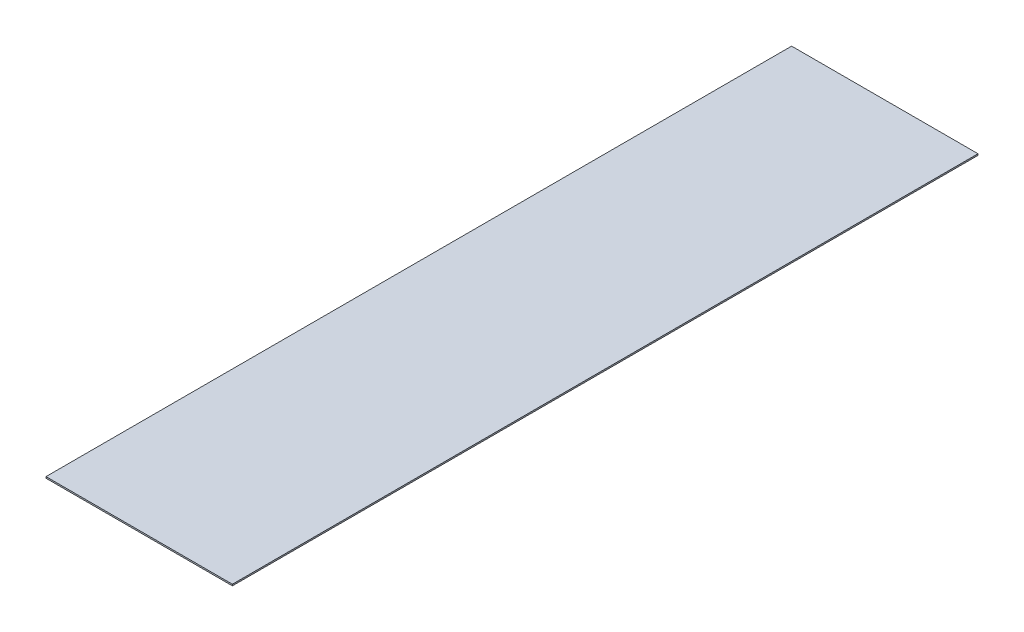
ISO-10303-21;
HEADER;
FILE_DESCRIPTION(('STEP AP214'),'2;1');
FILE_NAME('part.step','',(''),(''),'','','');
FILE_SCHEMA(('AUTOMOTIVE_DESIGN { 1 0 10303 214 1 1 1 1 }'));
ENDSEC;
DATA;
#1=APPLICATION_CONTEXT('core data for automotive mechanical design processes');
#2=APPLICATION_PROTOCOL_DEFINITION('international standard','automotive_design',2000,#1);
#3=PRODUCT_CONTEXT('',#1,'mechanical');
#4=PRODUCT('Part','Part','',(#3));
#5=PRODUCT_RELATED_PRODUCT_CATEGORY('part','',(#4));
#6=PRODUCT_DEFINITION_FORMATION('','',#4);
#7=PRODUCT_DEFINITION_CONTEXT('part definition',#1,'design');
#8=PRODUCT_DEFINITION('design','',#6,#7);
#9=PRODUCT_DEFINITION_SHAPE('','',#8);
#10=(LENGTH_UNIT() NAMED_UNIT(*) SI_UNIT(.MILLI.,.METRE.));
#11=(NAMED_UNIT(*) PLANE_ANGLE_UNIT() SI_UNIT($,.RADIAN.));
#12=(NAMED_UNIT(*) SI_UNIT($,.STERADIAN.) SOLID_ANGLE_UNIT());
#13=UNCERTAINTY_MEASURE_WITH_UNIT(LENGTH_MEASURE(1.E-05),#10,'distance_accuracy_value','');
#14=(GEOMETRIC_REPRESENTATION_CONTEXT(3) GLOBAL_UNCERTAINTY_ASSIGNED_CONTEXT((#13)) GLOBAL_UNIT_ASSIGNED_CONTEXT((#10,
#11,#12)) REPRESENTATION_CONTEXT('',''));
#15=CARTESIAN_POINT('',(0.,0.,0.));
#16=DIRECTION('',(0.,0.,1.));
#17=DIRECTION('',(1.,0.,0.));
#18=AXIS2_PLACEMENT_3D('',#15,#16,#17);
#19=CARTESIAN_POINT('',(63.5,-0.5,-508.));
#20=DIRECTION('',(1.,0.,0.));
#21=DIRECTION('',(0.,0.,-1.));
#22=AXIS2_PLACEMENT_3D('',#19,#20,#21);
#23=PLANE('',#22);
#24=DIRECTION('',(0.,1.,0.));
#25=VECTOR('',#24,1.);
#26=CARTESIAN_POINT('',(63.5,-0.5,0.));
#27=LINE('',#26,#25);
#28=CARTESIAN_POINT('',(63.5,-0.5,0.));
#29=VERTEX_POINT('',#28);
#30=CARTESIAN_POINT('',(63.5,0.5,0.));
#31=VERTEX_POINT('',#30);
#32=EDGE_CURVE('E109',#29,#31,#27,.T.);
#33=ORIENTED_EDGE('',*,*,#32,.F.);
#34=DIRECTION('',(0.,0.,1.));
#35=VECTOR('',#34,1.);
#36=CARTESIAN_POINT('',(63.5,-0.5,-508.));
#37=LINE('',#36,#35);
#38=CARTESIAN_POINT('',(63.5,-0.5,-508.));
#39=VERTEX_POINT('',#38);
#40=EDGE_CURVE('E11',#39,#29,#37,.T.);
#41=ORIENTED_EDGE('',*,*,#40,.F.);
#42=DIRECTION('',(0.,1.,0.));
#43=VECTOR('',#42,1.);
#44=CARTESIAN_POINT('',(63.5,-0.5,-508.));
#45=LINE('',#44,#43);
#46=CARTESIAN_POINT('',(63.5,0.5,-508.));
#47=VERTEX_POINT('',#46);
#48=EDGE_CURVE('E101',#39,#47,#45,.T.);
#49=ORIENTED_EDGE('',*,*,#48,.T.);
#50=DIRECTION('',(0.,0.,1.));
#51=VECTOR('',#50,1.);
#52=CARTESIAN_POINT('',(63.5,0.5,-508.));
#53=LINE('',#52,#51);
#54=EDGE_CURVE('E42',#47,#31,#53,.T.);
#55=ORIENTED_EDGE('',*,*,#54,.T.);
#56=EDGE_LOOP('',(#33,#41,#49,#55));
#57=FACE_BOUND('',#56,.T.);
#58=ADVANCED_FACE('F39',(#57),#23,.T.);
#59=CARTESIAN_POINT('',(-63.5,-0.5,-508.));
#60=DIRECTION('',(0.,-1.,0.));
#61=DIRECTION('',(0.,0.,-1.));
#62=AXIS2_PLACEMENT_3D('',#59,#60,#61);
#63=PLANE('',#62);
#64=DIRECTION('',(1.,0.,0.));
#65=VECTOR('',#64,1.);
#66=CARTESIAN_POINT('',(-63.5,-0.5,0.));
#67=LINE('',#66,#65);
#68=CARTESIAN_POINT('',(-63.5,-0.5,0.));
#69=VERTEX_POINT('',#68);
#70=EDGE_CURVE('E104',#69,#29,#67,.T.);
#71=ORIENTED_EDGE('',*,*,#70,.F.);
#72=DIRECTION('',(0.,0.,1.));
#73=VECTOR('',#72,1.);
#74=CARTESIAN_POINT('',(-63.5,-0.5,-508.));
#75=LINE('',#74,#73);
#76=CARTESIAN_POINT('',(-63.5,-0.5,-508.));
#77=VERTEX_POINT('',#76);
#78=EDGE_CURVE('E49',#77,#69,#75,.T.);
#79=ORIENTED_EDGE('',*,*,#78,.F.);
#80=DIRECTION('',(1.,0.,0.));
#81=VECTOR('',#80,1.);
#82=CARTESIAN_POINT('',(-63.5,-0.5,-508.));
#83=LINE('',#82,#81);
#84=EDGE_CURVE('E96',#77,#39,#83,.T.);
#85=ORIENTED_EDGE('',*,*,#84,.T.);
#86=ORIENTED_EDGE('',*,*,#40,.T.);
#87=EDGE_LOOP('',(#71,#79,#85,#86));
#88=FACE_BOUND('',#87,.T.);
#89=ADVANCED_FACE('F125',(#88),#63,.T.);
#90=CARTESIAN_POINT('',(-63.5,-0.5,-508.));
#91=DIRECTION('',(-1.,0.,0.));
#92=DIRECTION('',(0.,0.,1.));
#93=AXIS2_PLACEMENT_3D('',#90,#91,#92);
#94=PLANE('',#93);
#95=DIRECTION('',(0.,-1.,0.));
#96=VECTOR('',#95,1.);
#97=CARTESIAN_POINT('',(-63.5,-0.5,0.));
#98=LINE('',#97,#96);
#99=CARTESIAN_POINT('',(-63.5,0.5,0.));
#100=VERTEX_POINT('',#99);
#101=EDGE_CURVE('E90',#100,#69,#98,.T.);
#102=ORIENTED_EDGE('',*,*,#101,.F.);
#103=DIRECTION('',(0.,0.,1.));
#104=VECTOR('',#103,1.);
#105=CARTESIAN_POINT('',(-63.5,0.5,-508.));
#106=LINE('',#105,#104);
#107=CARTESIAN_POINT('',(-63.5,0.5,-508.));
#108=VERTEX_POINT('',#107);
#109=EDGE_CURVE('E85',#108,#100,#106,.T.);
#110=ORIENTED_EDGE('',*,*,#109,.F.);
#111=DIRECTION('',(0.,-1.,0.));
#112=VECTOR('',#111,1.);
#113=CARTESIAN_POINT('',(-63.5,-0.5,-508.));
#114=LINE('',#113,#112);
#115=EDGE_CURVE('E88',#108,#77,#114,.T.);
#116=ORIENTED_EDGE('',*,*,#115,.T.);
#117=ORIENTED_EDGE('',*,*,#78,.T.);
#118=EDGE_LOOP('',(#102,#110,#116,#117));
#119=FACE_BOUND('',#118,.T.);
#120=ADVANCED_FACE('F87',(#119),#94,.T.);
#121=CARTESIAN_POINT('',(-63.5,0.5,-508.));
#122=DIRECTION('',(0.,1.,0.));
#123=DIRECTION('',(0.,0.,1.));
#124=AXIS2_PLACEMENT_3D('',#121,#122,#123);
#125=PLANE('',#124);
#126=DIRECTION('',(-1.,0.,0.));
#127=VECTOR('',#126,1.);
#128=CARTESIAN_POINT('',(-63.5,0.5,0.));
#129=LINE('',#128,#127);
#130=EDGE_CURVE('E113',#31,#100,#129,.T.);
#131=ORIENTED_EDGE('',*,*,#130,.F.);
#132=ORIENTED_EDGE('',*,*,#54,.F.);
#133=DIRECTION('',(-1.,0.,0.));
#134=VECTOR('',#133,1.);
#135=CARTESIAN_POINT('',(-63.5,0.5,-508.));
#136=LINE('',#135,#134);
#137=EDGE_CURVE('E95',#47,#108,#136,.T.);
#138=ORIENTED_EDGE('',*,*,#137,.T.);
#139=ORIENTED_EDGE('',*,*,#109,.T.);
#140=EDGE_LOOP('',(#131,#132,#138,#139));
#141=FACE_BOUND('',#140,.T.);
#142=ADVANCED_FACE('F99',(#141),#125,.T.);
#143=CARTESIAN_POINT('',(0.,0.,-508.));
#144=DIRECTION('',(0.,0.,-1.));
#145=DIRECTION('',(-1.,0.,0.));
#146=AXIS2_PLACEMENT_3D('',#143,#144,#145);
#147=PLANE('',#146);
#148=ORIENTED_EDGE('',*,*,#48,.F.);
#149=ORIENTED_EDGE('',*,*,#84,.F.);
#150=ORIENTED_EDGE('',*,*,#115,.F.);
#151=ORIENTED_EDGE('',*,*,#137,.F.);
#152=EDGE_LOOP('',(#148,#149,#150,#151));
#153=FACE_BOUND('',#152,.T.);
#154=ADVANCED_FACE('F94',(#153),#147,.T.);
#155=CARTESIAN_POINT('',(0.,0.,0.));
#156=DIRECTION('',(0.,0.,-1.));
#157=DIRECTION('',(-1.,0.,0.));
#158=AXIS2_PLACEMENT_3D('',#155,#156,#157);
#159=PLANE('',#158);
#160=ORIENTED_EDGE('',*,*,#32,.T.);
#161=ORIENTED_EDGE('',*,*,#130,.T.);
#162=ORIENTED_EDGE('',*,*,#101,.T.);
#163=ORIENTED_EDGE('',*,*,#70,.T.);
#164=EDGE_LOOP('',(#160,#161,#162,#163));
#165=FACE_BOUND('',#164,.T.);
#166=ADVANCED_FACE('F124',(#165),#159,.F.);
#167=CLOSED_SHELL('',(#58,#89,#120,#142,#154,#166));
#168=MANIFOLD_SOLID_BREP('B2',#167);
#169=ADVANCED_BREP_SHAPE_REPRESENTATION('',(#18,#168),#14);
#170=SHAPE_DEFINITION_REPRESENTATION(#9,#169);
ENDSEC;
END-ISO-10303-21;
